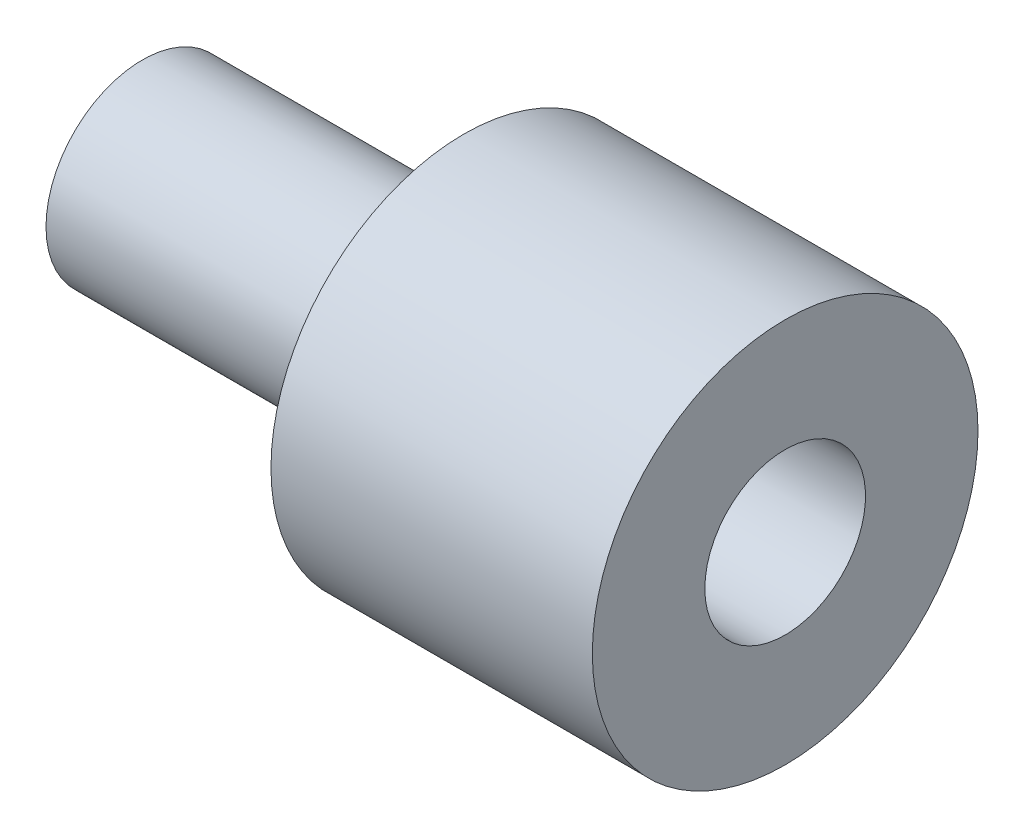
ISO-10303-21;
HEADER;
FILE_DESCRIPTION(('STEP AP214'),'2;1');
FILE_NAME('part.step','',(''),(''),'','','');
FILE_SCHEMA(('AUTOMOTIVE_DESIGN { 1 0 10303 214 1 1 1 1 }'));
ENDSEC;
DATA;
#1=APPLICATION_CONTEXT('core data for automotive mechanical design processes');
#2=APPLICATION_PROTOCOL_DEFINITION('international standard','automotive_design',2000,#1);
#3=PRODUCT_CONTEXT('',#1,'mechanical');
#4=PRODUCT('Part','Part','',(#3));
#5=PRODUCT_RELATED_PRODUCT_CATEGORY('part','',(#4));
#6=PRODUCT_DEFINITION_FORMATION('','',#4);
#7=PRODUCT_DEFINITION_CONTEXT('part definition',#1,'design');
#8=PRODUCT_DEFINITION('design','',#6,#7);
#9=PRODUCT_DEFINITION_SHAPE('','',#8);
#10=(LENGTH_UNIT() NAMED_UNIT(*) SI_UNIT(.MILLI.,.METRE.));
#11=(NAMED_UNIT(*) PLANE_ANGLE_UNIT() SI_UNIT($,.RADIAN.));
#12=(NAMED_UNIT(*) SI_UNIT($,.STERADIAN.) SOLID_ANGLE_UNIT());
#13=UNCERTAINTY_MEASURE_WITH_UNIT(LENGTH_MEASURE(1.E-05),#10,'distance_accuracy_value','');
#14=(GEOMETRIC_REPRESENTATION_CONTEXT(3) GLOBAL_UNCERTAINTY_ASSIGNED_CONTEXT((#13)) GLOBAL_UNIT_ASSIGNED_CONTEXT((#10,
#11,#12)) REPRESENTATION_CONTEXT('',''));
#15=CARTESIAN_POINT('',(0.,0.,0.));
#16=DIRECTION('',(0.,0.,1.));
#17=DIRECTION('',(1.,0.,0.));
#18=AXIS2_PLACEMENT_3D('',#15,#16,#17);
#19=CARTESIAN_POINT('',(0.,0.,0.));
#20=DIRECTION('',(-1.,0.,0.));
#21=DIRECTION('',(0.,0.,1.));
#22=AXIS2_PLACEMENT_3D('',#19,#20,#21);
#23=PLANE('',#22);
#24=CARTESIAN_POINT('',(0.,0.,0.));
#25=DIRECTION('',(-1.,0.,0.));
#26=DIRECTION('',(0.,0.,1.));
#27=AXIS2_PLACEMENT_3D('',#24,#25,#26);
#28=CIRCLE('',#27,5.);
#29=CARTESIAN_POINT('',(0.,0.,5.));
#30=VERTEX_POINT('',#29);
#31=EDGE_CURVE('E10',#30,#30,#28,.T.);
#32=ORIENTED_EDGE('',*,*,#31,.F.);
#33=EDGE_LOOP('',(#32));
#34=FACE_BOUND('',#33,.T.);
#35=ADVANCED_FACE('F34',(#34),#23,.F.);
#36=CARTESIAN_POINT('',(-28.,0.,0.));
#37=DIRECTION('',(-1.,0.,0.));
#38=DIRECTION('',(0.,0.,1.));
#39=AXIS2_PLACEMENT_3D('',#36,#37,#38);
#40=CYLINDRICAL_SURFACE('',#39,5.);
#41=CARTESIAN_POINT('',(12.,0.,0.));
#42=DIRECTION('',(-1.,0.,0.));
#43=DIRECTION('',(0.,0.,1.));
#44=AXIS2_PLACEMENT_3D('',#41,#42,#43);
#45=CIRCLE('',#44,5.);
#46=CARTESIAN_POINT('',(12.,0.,5.));
#47=VERTEX_POINT('',#46);
#48=EDGE_CURVE('E41',#47,#47,#45,.T.);
#49=ORIENTED_EDGE('',*,*,#48,.F.);
#50=EDGE_LOOP('',(#49));
#51=FACE_BOUND('',#50,.T.);
#52=ORIENTED_EDGE('',*,*,#31,.T.);
#53=EDGE_LOOP('',(#52));
#54=FACE_BOUND('',#53,.T.);
#55=ADVANCED_FACE('F91',(#51,#54),#40,.F.);
#56=CARTESIAN_POINT('',(12.,5.,0.));
#57=DIRECTION('',(-1.,0.,0.));
#58=DIRECTION('',(0.,0.,1.));
#59=AXIS2_PLACEMENT_3D('',#56,#57,#58);
#60=PLANE('',#59);
#61=CARTESIAN_POINT('',(12.,0.,0.));
#62=DIRECTION('',(-1.,0.,0.));
#63=DIRECTION('',(0.,0.,1.));
#64=AXIS2_PLACEMENT_3D('',#61,#62,#63);
#65=CIRCLE('',#64,12.);
#66=CARTESIAN_POINT('',(12.,0.,12.));
#67=VERTEX_POINT('',#66);
#68=EDGE_CURVE('E47',#67,#67,#65,.T.);
#69=ORIENTED_EDGE('',*,*,#68,.F.);
#70=EDGE_LOOP('',(#69));
#71=FACE_BOUND('',#70,.T.);
#72=ORIENTED_EDGE('',*,*,#48,.T.);
#73=EDGE_LOOP('',(#72));
#74=FACE_BOUND('',#73,.T.);
#75=ADVANCED_FACE('F86',(#71,#74),#60,.F.);
#76=CARTESIAN_POINT('',(-28.,0.,0.));
#77=DIRECTION('',(-1.,0.,0.));
#78=DIRECTION('',(0.,0.,1.));
#79=AXIS2_PLACEMENT_3D('',#76,#77,#78);
#80=CYLINDRICAL_SURFACE('',#79,12.);
#81=CARTESIAN_POINT('',(-8.00000000000001,0.,0.));
#82=DIRECTION('',(-1.,0.,0.));
#83=DIRECTION('',(0.,0.,1.));
#84=AXIS2_PLACEMENT_3D('',#81,#82,#83);
#85=CIRCLE('',#84,12.);
#86=CARTESIAN_POINT('',(-8.00000000000001,0.,12.));
#87=VERTEX_POINT('',#86);
#88=EDGE_CURVE('E53',#87,#87,#85,.T.);
#89=ORIENTED_EDGE('',*,*,#88,.F.);
#90=EDGE_LOOP('',(#89));
#91=FACE_BOUND('',#90,.T.);
#92=ORIENTED_EDGE('',*,*,#68,.T.);
#93=EDGE_LOOP('',(#92));
#94=FACE_BOUND('',#93,.T.);
#95=ADVANCED_FACE('F80',(#91,#94),#80,.T.);
#96=CARTESIAN_POINT('',(-8.00000000000001,12.,0.));
#97=DIRECTION('',(1.,0.,0.));
#98=DIRECTION('',(0.,0.,-1.));
#99=AXIS2_PLACEMENT_3D('',#96,#97,#98);
#100=PLANE('',#99);
#101=CARTESIAN_POINT('',(-8.00000000000001,0.,0.));
#102=DIRECTION('',(-1.,0.,0.));
#103=DIRECTION('',(0.,0.,1.));
#104=AXIS2_PLACEMENT_3D('',#101,#102,#103);
#105=CIRCLE('',#104,6.);
#106=CARTESIAN_POINT('',(-8.00000000000001,0.,6.));
#107=VERTEX_POINT('',#106);
#108=EDGE_CURVE('E59',#107,#107,#105,.T.);
#109=ORIENTED_EDGE('',*,*,#108,.F.);
#110=EDGE_LOOP('',(#109));
#111=FACE_BOUND('',#110,.T.);
#112=ORIENTED_EDGE('',*,*,#88,.T.);
#113=EDGE_LOOP('',(#112));
#114=FACE_BOUND('',#113,.T.);
#115=ADVANCED_FACE('F74',(#111,#114),#100,.F.);
#116=CARTESIAN_POINT('',(-28.,0.,0.));
#117=DIRECTION('',(-1.,0.,0.));
#118=DIRECTION('',(0.,0.,1.));
#119=AXIS2_PLACEMENT_3D('',#116,#117,#118);
#120=CYLINDRICAL_SURFACE('',#119,6.);
#121=CARTESIAN_POINT('',(-28.,0.,0.));
#122=DIRECTION('',(-1.,0.,0.));
#123=DIRECTION('',(0.,0.,1.));
#124=AXIS2_PLACEMENT_3D('',#121,#122,#123);
#125=CIRCLE('',#124,6.);
#126=CARTESIAN_POINT('',(-28.,0.,6.));
#127=VERTEX_POINT('',#126);
#128=EDGE_CURVE('E63',#127,#127,#125,.T.);
#129=ORIENTED_EDGE('',*,*,#128,.F.);
#130=EDGE_LOOP('',(#129));
#131=FACE_BOUND('',#130,.T.);
#132=ORIENTED_EDGE('',*,*,#108,.T.);
#133=EDGE_LOOP('',(#132));
#134=FACE_BOUND('',#133,.T.);
#135=ADVANCED_FACE('F71',(#131,#134),#120,.T.);
#136=CARTESIAN_POINT('',(-28.,6.,0.));
#137=DIRECTION('',(1.,0.,0.));
#138=DIRECTION('',(0.,0.,-1.));
#139=AXIS2_PLACEMENT_3D('',#136,#137,#138);
#140=PLANE('',#139);
#141=ORIENTED_EDGE('',*,*,#128,.T.);
#142=EDGE_LOOP('',(#141));
#143=FACE_BOUND('',#142,.T.);
#144=ADVANCED_FACE('F69',(#143),#140,.F.);
#145=CLOSED_SHELL('',(#35,#55,#75,#95,#115,#135,#144));
#146=MANIFOLD_SOLID_BREP('B2',#145);
#147=ADVANCED_BREP_SHAPE_REPRESENTATION('',(#18,#146),#14);
#148=SHAPE_DEFINITION_REPRESENTATION(#9,#147);
ENDSEC;
END-ISO-10303-21;
